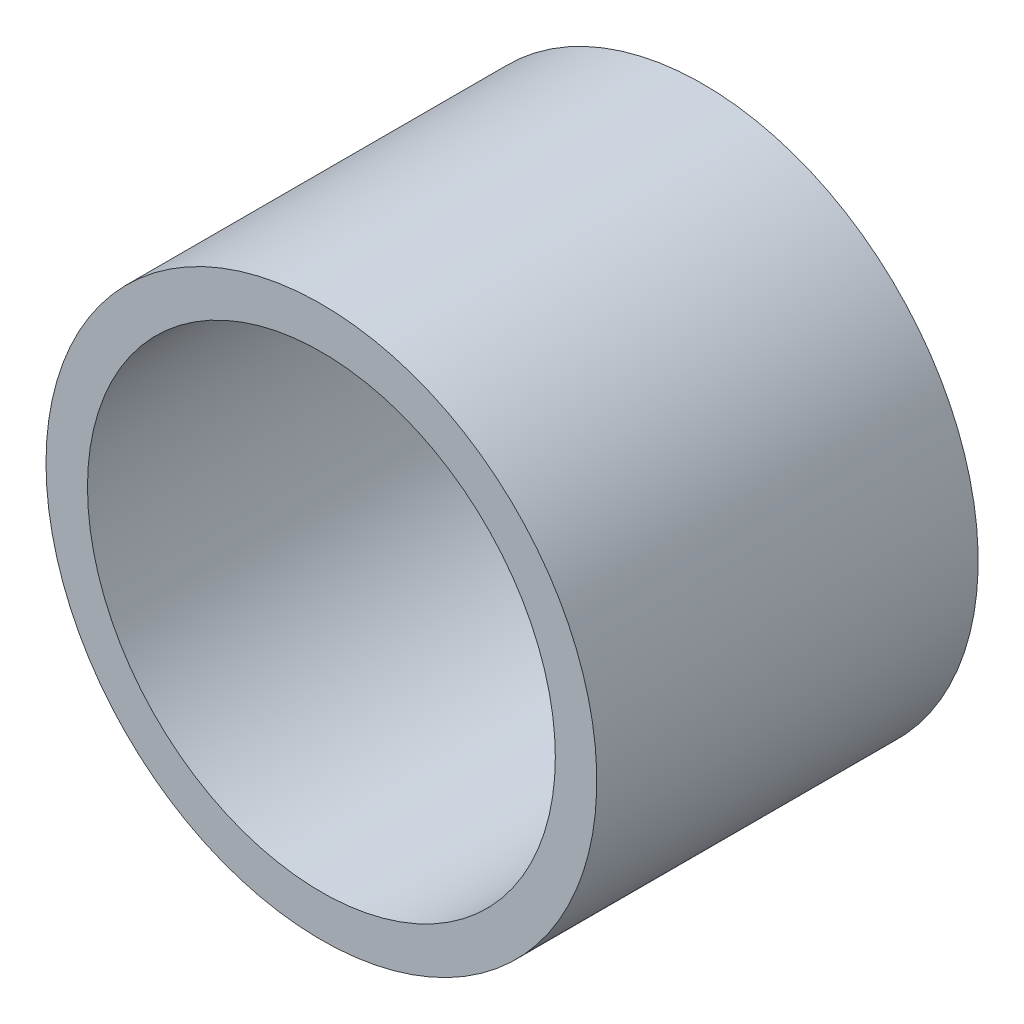
ISO-10303-21;
HEADER;
FILE_DESCRIPTION(('STEP AP214'),'2;1');
FILE_NAME('part.step','',(''),(''),'','','');
FILE_SCHEMA(('AUTOMOTIVE_DESIGN { 1 0 10303 214 1 1 1 1 }'));
ENDSEC;
DATA;
#1=APPLICATION_CONTEXT('core data for automotive mechanical design processes');
#2=APPLICATION_PROTOCOL_DEFINITION('international standard','automotive_design',2000,#1);
#3=PRODUCT_CONTEXT('',#1,'mechanical');
#4=PRODUCT('Part','Part','',(#3));
#5=PRODUCT_RELATED_PRODUCT_CATEGORY('part','',(#4));
#6=PRODUCT_DEFINITION_FORMATION('','',#4);
#7=PRODUCT_DEFINITION_CONTEXT('part definition',#1,'design');
#8=PRODUCT_DEFINITION('design','',#6,#7);
#9=PRODUCT_DEFINITION_SHAPE('','',#8);
#10=(LENGTH_UNIT() NAMED_UNIT(*) SI_UNIT(.MILLI.,.METRE.));
#11=(NAMED_UNIT(*) PLANE_ANGLE_UNIT() SI_UNIT($,.RADIAN.));
#12=(NAMED_UNIT(*) SI_UNIT($,.STERADIAN.) SOLID_ANGLE_UNIT());
#13=UNCERTAINTY_MEASURE_WITH_UNIT(LENGTH_MEASURE(1.E-05),#10,'distance_accuracy_value','');
#14=(GEOMETRIC_REPRESENTATION_CONTEXT(3) GLOBAL_UNCERTAINTY_ASSIGNED_CONTEXT((#13)) GLOBAL_UNIT_ASSIGNED_CONTEXT((#10,
#11,#12)) REPRESENTATION_CONTEXT('',''));
#15=CARTESIAN_POINT('',(0.,0.,0.));
#16=DIRECTION('',(0.,0.,1.));
#17=DIRECTION('',(1.,0.,0.));
#18=AXIS2_PLACEMENT_3D('',#15,#16,#17);
#19=CARTESIAN_POINT('',(0.,0.,44.831));
#20=DIRECTION('',(0.,0.,1.));
#21=DIRECTION('',(1.,0.,0.));
#22=AXIS2_PLACEMENT_3D('',#19,#20,#21);
#23=PLANE('',#22);
#24=CARTESIAN_POINT('',(0.,0.,44.831));
#25=DIRECTION('',(0.,0.,1.));
#26=DIRECTION('',(1.,0.,0.));
#27=AXIS2_PLACEMENT_3D('',#24,#25,#26);
#28=CIRCLE('',#27,32.375);
#29=CARTESIAN_POINT('',(-32.375,0.,44.831));
#30=VERTEX_POINT('',#29);
#31=EDGE_CURVE('E10',#30,#30,#28,.T.);
#32=ORIENTED_EDGE('',*,*,#31,.T.);
#33=EDGE_LOOP('',(#32));
#34=FACE_BOUND('',#33,.T.);
#35=CARTESIAN_POINT('',(0.,0.,44.831));
#36=DIRECTION('',(0.,0.,1.));
#37=DIRECTION('',(1.,0.,0.));
#38=AXIS2_PLACEMENT_3D('',#35,#36,#37);
#39=CIRCLE('',#38,27.5);
#40=CARTESIAN_POINT('',(-27.5,0.,44.831));
#41=VERTEX_POINT('',#40);
#42=EDGE_CURVE('E50',#41,#41,#39,.T.);
#43=ORIENTED_EDGE('',*,*,#42,.F.);
#44=EDGE_LOOP('',(#43));
#45=FACE_BOUND('',#44,.T.);
#46=ADVANCED_FACE('F37',(#34,#45),#23,.T.);
#47=CARTESIAN_POINT('',(0.,0.,0.));
#48=DIRECTION('',(0.,0.,1.));
#49=DIRECTION('',(1.,0.,0.));
#50=AXIS2_PLACEMENT_3D('',#47,#48,#49);
#51=PLANE('',#50);
#52=CARTESIAN_POINT('',(0.,0.,0.));
#53=DIRECTION('',(0.,0.,1.));
#54=DIRECTION('',(1.,0.,0.));
#55=AXIS2_PLACEMENT_3D('',#52,#53,#54);
#56=CIRCLE('',#55,32.375);
#57=CARTESIAN_POINT('',(-32.375,0.,0.));
#58=VERTEX_POINT('',#57);
#59=EDGE_CURVE('E41',#58,#58,#56,.T.);
#60=ORIENTED_EDGE('',*,*,#59,.F.);
#61=EDGE_LOOP('',(#60));
#62=FACE_BOUND('',#61,.T.);
#63=CARTESIAN_POINT('',(0.,0.,0.));
#64=DIRECTION('',(0.,0.,1.));
#65=DIRECTION('',(1.,0.,0.));
#66=AXIS2_PLACEMENT_3D('',#63,#64,#65);
#67=CIRCLE('',#66,27.5);
#68=CARTESIAN_POINT('',(-27.5,0.,0.));
#69=VERTEX_POINT('',#68);
#70=EDGE_CURVE('E52',#69,#69,#67,.T.);
#71=ORIENTED_EDGE('',*,*,#70,.T.);
#72=EDGE_LOOP('',(#71));
#73=FACE_BOUND('',#72,.T.);
#74=ADVANCED_FACE('F64',(#62,#73),#51,.F.);
#75=CARTESIAN_POINT('',(0.,0.,44.831));
#76=DIRECTION('',(0.,0.,-1.));
#77=DIRECTION('',(-1.,0.,0.));
#78=AXIS2_PLACEMENT_3D('',#75,#76,#77);
#79=CYLINDRICAL_SURFACE('',#78,32.375);
#80=CARTESIAN_POINT('',(-32.375,0.,44.831));
#81=CARTESIAN_POINT('',(-32.375,0.,44.3640104166667));
#82=CARTESIAN_POINT('',(-32.375,0.,43.8970208333333));
#83=CARTESIAN_POINT('',(-32.375,0.,42.9630416666667));
#84=CARTESIAN_POINT('',(-32.375,0.,42.4960520833333));
#85=CARTESIAN_POINT('',(-32.375,0.,41.5620729166667));
#86=CARTESIAN_POINT('',(-32.375,0.,41.0950833333333));
#87=CARTESIAN_POINT('',(-32.375,0.,40.1611041666667));
#88=CARTESIAN_POINT('',(-32.375,0.,39.6941145833333));
#89=CARTESIAN_POINT('',(-32.375,0.,38.7601354166667));
#90=CARTESIAN_POINT('',(-32.375,0.,38.2931458333333));
#91=CARTESIAN_POINT('',(-32.375,0.,37.3591666666667));
#92=CARTESIAN_POINT('',(-32.375,0.,36.8921770833333));
#93=CARTESIAN_POINT('',(-32.375,0.,35.9581979166667));
#94=CARTESIAN_POINT('',(-32.375,0.,35.4912083333333));
#95=CARTESIAN_POINT('',(-32.375,0.,34.5572291666667));
#96=CARTESIAN_POINT('',(-32.375,0.,34.0902395833333));
#97=CARTESIAN_POINT('',(-32.375,0.,33.1562604166667));
#98=CARTESIAN_POINT('',(-32.375,0.,32.6892708333333));
#99=CARTESIAN_POINT('',(-32.375,0.,31.7552916666667));
#100=CARTESIAN_POINT('',(-32.375,0.,31.2883020833333));
#101=CARTESIAN_POINT('',(-32.375,0.,30.3543229166667));
#102=CARTESIAN_POINT('',(-32.375,0.,29.8873333333333));
#103=CARTESIAN_POINT('',(-32.375,0.,28.9533541666667));
#104=CARTESIAN_POINT('',(-32.375,0.,28.4863645833333));
#105=CARTESIAN_POINT('',(-32.375,0.,27.5523854166667));
#106=CARTESIAN_POINT('',(-32.375,0.,27.0853958333333));
#107=CARTESIAN_POINT('',(-32.375,0.,26.1514166666667));
#108=CARTESIAN_POINT('',(-32.375,0.,25.6844270833333));
#109=CARTESIAN_POINT('',(-32.375,0.,24.7504479166667));
#110=CARTESIAN_POINT('',(-32.375,0.,24.2834583333333));
#111=CARTESIAN_POINT('',(-32.375,0.,23.3494791666667));
#112=CARTESIAN_POINT('',(-32.375,0.,22.8824895833333));
#113=CARTESIAN_POINT('',(-32.375,0.,21.9485104166667));
#114=CARTESIAN_POINT('',(-32.375,0.,21.4815208333333));
#115=CARTESIAN_POINT('',(-32.375,0.,20.5475416666667));
#116=CARTESIAN_POINT('',(-32.375,0.,20.0805520833333));
#117=CARTESIAN_POINT('',(-32.375,0.,19.1465729166667));
#118=CARTESIAN_POINT('',(-32.375,0.,18.6795833333333));
#119=CARTESIAN_POINT('',(-32.375,0.,17.7456041666667));
#120=CARTESIAN_POINT('',(-32.375,0.,17.2786145833333));
#121=CARTESIAN_POINT('',(-32.375,0.,16.3446354166667));
#122=CARTESIAN_POINT('',(-32.375,0.,15.8776458333333));
#123=CARTESIAN_POINT('',(-32.375,0.,14.9436666666667));
#124=CARTESIAN_POINT('',(-32.375,0.,14.4766770833333));
#125=CARTESIAN_POINT('',(-32.375,0.,13.5426979166667));
#126=CARTESIAN_POINT('',(-32.375,0.,13.0757083333333));
#127=CARTESIAN_POINT('',(-32.375,0.,12.1417291666667));
#128=CARTESIAN_POINT('',(-32.375,0.,11.6747395833333));
#129=CARTESIAN_POINT('',(-32.375,0.,10.7407604166667));
#130=CARTESIAN_POINT('',(-32.375,0.,10.2737708333333));
#131=CARTESIAN_POINT('',(-32.375,0.,9.33979166666666));
#132=CARTESIAN_POINT('',(-32.375,0.,8.87280208333333));
#133=CARTESIAN_POINT('',(-32.375,0.,7.93882291666666));
#134=CARTESIAN_POINT('',(-32.375,0.,7.47183333333333));
#135=CARTESIAN_POINT('',(-32.375,0.,6.53785416666666));
#136=CARTESIAN_POINT('',(-32.375,0.,6.07086458333333));
#137=CARTESIAN_POINT('',(-32.375,0.,5.13688541666666));
#138=CARTESIAN_POINT('',(-32.375,0.,4.66989583333333));
#139=CARTESIAN_POINT('',(-32.375,0.,3.73591666666666));
#140=CARTESIAN_POINT('',(-32.375,0.,3.26892708333333));
#141=CARTESIAN_POINT('',(-32.375,0.,2.33494791666666));
#142=CARTESIAN_POINT('',(-32.375,0.,1.86795833333333));
#143=CARTESIAN_POINT('',(-32.375,0.,0.933979166666661));
#144=CARTESIAN_POINT('',(-32.375,0.,0.466989583333327));
#145=CARTESIAN_POINT('',(-32.375,0.,0.));
#146=B_SPLINE_CURVE_WITH_KNOTS('',3,(#80,#81,#82,#83,#84,#85,#86,#87,#88,#89,#90,#91,#92,#93,
#94,#95,#96,#97,#98,#99,#100,#101,#102,#103,#104,#105,#106,#107,#108,#109,#110,#111,#112,#113,
#114,#115,#116,#117,#118,#119,#120,#121,#122,#123,#124,#125,#126,#127,#128,#129,#130,#131,#132,
#133,#134,#135,#136,#137,#138,#139,#140,#141,#142,#143,#144,#145),.UNSPECIFIED.,.F.,.F.,(4,2,2,
2,2,2,2,2,2,2,2,2,2,2,2,2,2,2,2,2,2,2,2,2,2,2,2,2,2,2,2,2,4),(0.,1.40096875,2.8019375,
4.20290625000001,5.603875,7.00484375,8.40581250000001,9.80678125000001,11.20775,12.60871875,
14.0096875,15.41065625,16.811625,18.21259375,19.6135625,21.01453125,22.4155,23.81646875,
25.2174375,26.61840625,28.019375,29.42034375,30.8213125,32.22228125,33.62325,35.02421875,
36.4251875,37.82615625,39.227125,40.62809375,42.0290625,43.43003125,44.831),.UNSPECIFIED.);
#147=EDGE_CURVE('BSEAM39',#30,#58,#146,.T.);
#148=ORIENTED_EDGE('',*,*,#31,.F.);
#149=ORIENTED_EDGE('',*,*,#59,.T.);
#150=ORIENTED_EDGE('',*,*,#147,.T.);
#151=ORIENTED_EDGE('',*,*,#147,.F.);
#152=EDGE_LOOP('',(#148,#150,#149,#151));
#153=FACE_BOUND('',#152,.T.);
#154=ADVANCED_FACE('F39',(#153),#79,.T.);
#155=CARTESIAN_POINT('',(0.,0.,44.831));
#156=DIRECTION('',(0.,0.,-1.));
#157=DIRECTION('',(-1.,0.,0.));
#158=AXIS2_PLACEMENT_3D('',#155,#156,#157);
#159=CYLINDRICAL_SURFACE('',#158,27.5);
#160=CARTESIAN_POINT('',(-27.5,0.,44.831));
#161=CARTESIAN_POINT('',(-27.5,0.,44.3640104166667));
#162=CARTESIAN_POINT('',(-27.5,0.,43.8970208333333));
#163=CARTESIAN_POINT('',(-27.5,0.,42.9630416666667));
#164=CARTESIAN_POINT('',(-27.5,0.,42.4960520833333));
#165=CARTESIAN_POINT('',(-27.5,0.,41.5620729166667));
#166=CARTESIAN_POINT('',(-27.5,0.,41.0950833333333));
#167=CARTESIAN_POINT('',(-27.5,0.,40.1611041666667));
#168=CARTESIAN_POINT('',(-27.5,0.,39.6941145833333));
#169=CARTESIAN_POINT('',(-27.5,0.,38.7601354166667));
#170=CARTESIAN_POINT('',(-27.5,0.,38.2931458333333));
#171=CARTESIAN_POINT('',(-27.5,0.,37.3591666666667));
#172=CARTESIAN_POINT('',(-27.5,0.,36.8921770833333));
#173=CARTESIAN_POINT('',(-27.5,0.,35.9581979166667));
#174=CARTESIAN_POINT('',(-27.5,0.,35.4912083333333));
#175=CARTESIAN_POINT('',(-27.5,0.,34.5572291666667));
#176=CARTESIAN_POINT('',(-27.5,0.,34.0902395833333));
#177=CARTESIAN_POINT('',(-27.5,0.,33.1562604166667));
#178=CARTESIAN_POINT('',(-27.5,0.,32.6892708333333));
#179=CARTESIAN_POINT('',(-27.5,0.,31.7552916666667));
#180=CARTESIAN_POINT('',(-27.5,0.,31.2883020833333));
#181=CARTESIAN_POINT('',(-27.5,0.,30.3543229166667));
#182=CARTESIAN_POINT('',(-27.5,0.,29.8873333333333));
#183=CARTESIAN_POINT('',(-27.5,0.,28.9533541666667));
#184=CARTESIAN_POINT('',(-27.5,0.,28.4863645833333));
#185=CARTESIAN_POINT('',(-27.5,0.,27.5523854166667));
#186=CARTESIAN_POINT('',(-27.5,0.,27.0853958333333));
#187=CARTESIAN_POINT('',(-27.5,0.,26.1514166666667));
#188=CARTESIAN_POINT('',(-27.5,0.,25.6844270833333));
#189=CARTESIAN_POINT('',(-27.5,0.,24.7504479166667));
#190=CARTESIAN_POINT('',(-27.5,0.,24.2834583333333));
#191=CARTESIAN_POINT('',(-27.5,0.,23.3494791666667));
#192=CARTESIAN_POINT('',(-27.5,0.,22.8824895833333));
#193=CARTESIAN_POINT('',(-27.5,0.,21.9485104166667));
#194=CARTESIAN_POINT('',(-27.5,0.,21.4815208333333));
#195=CARTESIAN_POINT('',(-27.5,0.,20.5475416666667));
#196=CARTESIAN_POINT('',(-27.5,0.,20.0805520833333));
#197=CARTESIAN_POINT('',(-27.5,0.,19.1465729166667));
#198=CARTESIAN_POINT('',(-27.5,0.,18.6795833333333));
#199=CARTESIAN_POINT('',(-27.5,0.,17.7456041666667));
#200=CARTESIAN_POINT('',(-27.5,0.,17.2786145833333));
#201=CARTESIAN_POINT('',(-27.5,0.,16.3446354166667));
#202=CARTESIAN_POINT('',(-27.5,0.,15.8776458333333));
#203=CARTESIAN_POINT('',(-27.5,0.,14.9436666666667));
#204=CARTESIAN_POINT('',(-27.5,0.,14.4766770833333));
#205=CARTESIAN_POINT('',(-27.5,0.,13.5426979166667));
#206=CARTESIAN_POINT('',(-27.5,0.,13.0757083333333));
#207=CARTESIAN_POINT('',(-27.5,0.,12.1417291666667));
#208=CARTESIAN_POINT('',(-27.5,0.,11.6747395833333));
#209=CARTESIAN_POINT('',(-27.5,0.,10.7407604166667));
#210=CARTESIAN_POINT('',(-27.5,0.,10.2737708333333));
#211=CARTESIAN_POINT('',(-27.5,0.,9.33979166666666));
#212=CARTESIAN_POINT('',(-27.5,0.,8.87280208333333));
#213=CARTESIAN_POINT('',(-27.5,0.,7.93882291666666));
#214=CARTESIAN_POINT('',(-27.5,0.,7.47183333333333));
#215=CARTESIAN_POINT('',(-27.5,0.,6.53785416666666));
#216=CARTESIAN_POINT('',(-27.5,0.,6.07086458333333));
#217=CARTESIAN_POINT('',(-27.5,0.,5.13688541666666));
#218=CARTESIAN_POINT('',(-27.5,0.,4.66989583333333));
#219=CARTESIAN_POINT('',(-27.5,0.,3.73591666666666));
#220=CARTESIAN_POINT('',(-27.5,0.,3.26892708333333));
#221=CARTESIAN_POINT('',(-27.5,0.,2.33494791666666));
#222=CARTESIAN_POINT('',(-27.5,0.,1.86795833333333));
#223=CARTESIAN_POINT('',(-27.5,0.,0.933979166666661));
#224=CARTESIAN_POINT('',(-27.5,0.,0.466989583333327));
#225=CARTESIAN_POINT('',(-27.5,0.,0.));
#226=B_SPLINE_CURVE_WITH_KNOTS('',3,(#160,#161,#162,#163,#164,#165,#166,#167,#168,#169,#170,
#171,#172,#173,#174,#175,#176,#177,#178,#179,#180,#181,#182,#183,#184,#185,#186,#187,#188,#189,
#190,#191,#192,#193,#194,#195,#196,#197,#198,#199,#200,#201,#202,#203,#204,#205,#206,#207,#208,
#209,#210,#211,#212,#213,#214,#215,#216,#217,#218,#219,#220,#221,#222,#223,#224,#225),
.UNSPECIFIED.,.F.,.F.,(4,2,2,2,2,2,2,2,2,2,2,2,2,2,2,2,2,2,2,2,2,2,2,2,2,2,2,2,2,2,2,2,4),(0.,
1.40096875,2.8019375,4.20290625000001,5.603875,7.00484375,8.40581250000001,9.80678125000001,
11.20775,12.60871875,14.0096875,15.41065625,16.811625,18.21259375,19.6135625,21.01453125,
22.4155,23.81646875,25.2174375,26.61840625,28.019375,29.42034375,30.8213125,32.22228125,
33.62325,35.02421875,36.4251875,37.82615625,39.227125,40.62809375,42.0290625,43.43003125,
44.831),.UNSPECIFIED.);
#227=EDGE_CURVE('BSEAM60',#41,#69,#226,.T.);
#228=ORIENTED_EDGE('',*,*,#42,.T.);
#229=ORIENTED_EDGE('',*,*,#70,.F.);
#230=ORIENTED_EDGE('',*,*,#227,.T.);
#231=ORIENTED_EDGE('',*,*,#227,.F.);
#232=EDGE_LOOP('',(#228,#230,#229,#231));
#233=FACE_BOUND('',#232,.T.);
#234=ADVANCED_FACE('F60',(#233),#159,.F.);
#235=CLOSED_SHELL('',(#46,#74,#154,#234));
#236=MANIFOLD_SOLID_BREP('B2',#235);
#237=ADVANCED_BREP_SHAPE_REPRESENTATION('',(#18,#236),#14);
#238=SHAPE_DEFINITION_REPRESENTATION(#9,#237);
ENDSEC;
END-ISO-10303-21;
